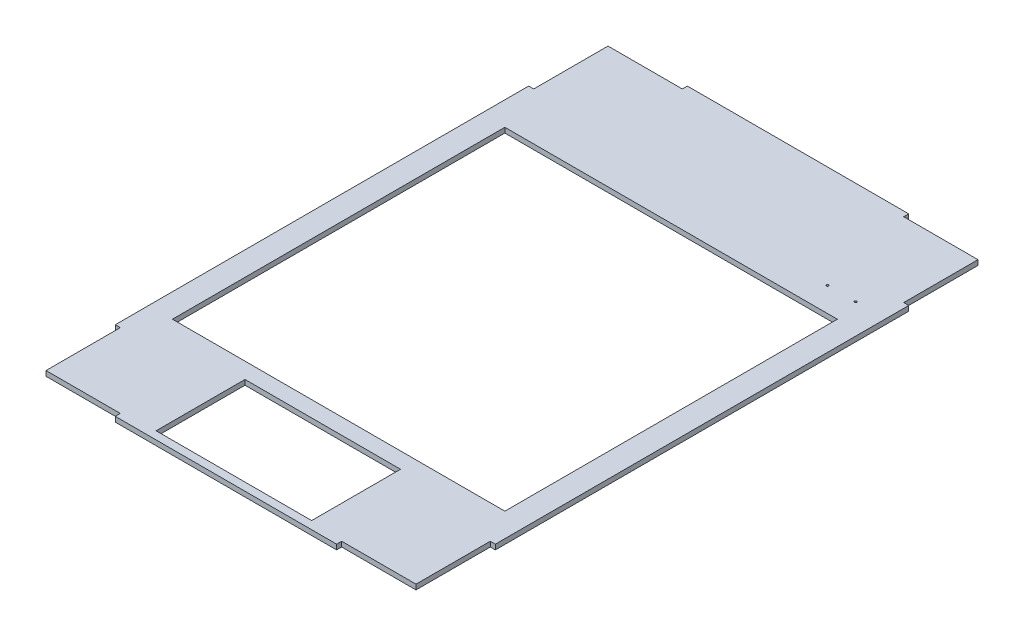
ISO-10303-21;
HEADER;
FILE_DESCRIPTION(('STEP AP214'),'2;1');
FILE_NAME('part.step','',(''),(''),'','','');
FILE_SCHEMA(('AUTOMOTIVE_DESIGN { 1 0 10303 214 1 1 1 1 }'));
ENDSEC;
DATA;
#1=APPLICATION_CONTEXT('core data for automotive mechanical design processes');
#2=APPLICATION_PROTOCOL_DEFINITION('international standard','automotive_design',2000,#1);
#3=PRODUCT_CONTEXT('',#1,'mechanical');
#4=PRODUCT('Part','Part','',(#3));
#5=PRODUCT_RELATED_PRODUCT_CATEGORY('part','',(#4));
#6=PRODUCT_DEFINITION_FORMATION('','',#4);
#7=PRODUCT_DEFINITION_CONTEXT('part definition',#1,'design');
#8=PRODUCT_DEFINITION('design','',#6,#7);
#9=PRODUCT_DEFINITION_SHAPE('','',#8);
#10=(LENGTH_UNIT() NAMED_UNIT(*) SI_UNIT(.MILLI.,.METRE.));
#11=(NAMED_UNIT(*) PLANE_ANGLE_UNIT() SI_UNIT($,.RADIAN.));
#12=(NAMED_UNIT(*) SI_UNIT($,.STERADIAN.) SOLID_ANGLE_UNIT());
#13=UNCERTAINTY_MEASURE_WITH_UNIT(LENGTH_MEASURE(1.E-05),#10,'distance_accuracy_value','');
#14=(GEOMETRIC_REPRESENTATION_CONTEXT(3) GLOBAL_UNCERTAINTY_ASSIGNED_CONTEXT((#13)) GLOBAL_UNIT_ASSIGNED_CONTEXT((#10,
#11,#12)) REPRESENTATION_CONTEXT('',''));
#15=CARTESIAN_POINT('',(0.,0.,0.));
#16=DIRECTION('',(0.,0.,1.));
#17=DIRECTION('',(1.,0.,0.));
#18=AXIS2_PLACEMENT_3D('',#15,#16,#17);
#19=CARTESIAN_POINT('',(0.,3.175,0.));
#20=DIRECTION('',(0.,-1.,0.));
#21=DIRECTION('',(0.,0.,-1.));
#22=AXIS2_PLACEMENT_3D('',#19,#20,#21);
#23=PLANE('',#22);
#24=CARTESIAN_POINT('',(166.32,3.175,-240.12));
#25=DIRECTION('',(0.,1.,0.));
#26=DIRECTION('',(0.,0.,1.));
#27=AXIS2_PLACEMENT_3D('',#24,#25,#26);
#28=CIRCLE('',#27,1.37499999999999);
#29=CARTESIAN_POINT('',(166.32,3.175,-238.745));
#30=VERTEX_POINT('',#29);
#31=EDGE_CURVE('E903',#30,#30,#28,.T.);
#32=ORIENTED_EDGE('',*,*,#31,.F.);
#33=EDGE_LOOP('',(#32));
#34=FACE_BOUND('',#33,.T.);
#35=CARTESIAN_POINT('',(201.88,3.175,-240.12));
#36=DIRECTION('',(0.,1.,0.));
#37=DIRECTION('',(0.,0.,1.));
#38=AXIS2_PLACEMENT_3D('',#35,#36,#37);
#39=CIRCLE('',#38,1.37499999999999);
#40=CARTESIAN_POINT('',(201.88,3.175,-238.745));
#41=VERTEX_POINT('',#40);
#42=EDGE_CURVE('E259',#41,#41,#39,.T.);
#43=ORIENTED_EDGE('',*,*,#42,.F.);
#44=EDGE_LOOP('',(#43));
#45=FACE_BOUND('',#44,.T.);
#46=DIRECTION('',(0.,0.,-1.));
#47=VECTOR('',#46,1.);
#48=CARTESIAN_POINT('',(209.5,3.175,209.5));
#49=LINE('',#48,#47);
#50=CARTESIAN_POINT('',(209.5,3.175,209.5));
#51=VERTEX_POINT('',#50);
#52=CARTESIAN_POINT('',(209.5,3.175,-209.5));
#53=VERTEX_POINT('',#52);
#54=EDGE_CURVE('E469',#51,#53,#49,.T.);
#55=ORIENTED_EDGE('',*,*,#54,.F.);
#56=DIRECTION('',(1.,0.,0.));
#57=VECTOR('',#56,1.);
#58=CARTESIAN_POINT('',(-209.5,3.175,209.5));
#59=LINE('',#58,#57);
#60=CARTESIAN_POINT('',(-209.5,3.175,209.5));
#61=VERTEX_POINT('',#60);
#62=EDGE_CURVE('E480',#61,#51,#59,.T.);
#63=ORIENTED_EDGE('',*,*,#62,.F.);
#64=DIRECTION('',(0.,0.,1.));
#65=VECTOR('',#64,1.);
#66=CARTESIAN_POINT('',(-209.5,3.175,209.5));
#67=LINE('',#66,#65);
#68=CARTESIAN_POINT('',(-209.5,3.175,-209.5));
#69=VERTEX_POINT('',#68);
#70=EDGE_CURVE('E476',#69,#61,#67,.T.);
#71=ORIENTED_EDGE('',*,*,#70,.F.);
#72=DIRECTION('',(-1.,0.,0.));
#73=VECTOR('',#72,1.);
#74=CARTESIAN_POINT('',(-209.5,3.175,-209.5));
#75=LINE('',#74,#73);
#76=EDGE_CURVE('E472',#53,#69,#75,.T.);
#77=ORIENTED_EDGE('',*,*,#76,.F.);
#78=EDGE_LOOP('',(#55,#63,#71,#77));
#79=FACE_BOUND('',#78,.T.);
#80=DIRECTION('',(0.,0.,1.));
#81=VECTOR('',#80,1.);
#82=CARTESIAN_POINT('',(-239.5,3.175,351.5));
#83=LINE('',#82,#81);
#84=CARTESIAN_POINT('',(-239.5,3.175,-269.5));
#85=VERTEX_POINT('',#84);
#86=CARTESIAN_POINT('',(-239.5,3.175,251.5));
#87=VERTEX_POINT('',#86);
#88=EDGE_CURVE('E48',#85,#87,#83,.T.);
#89=ORIENTED_EDGE('',*,*,#88,.T.);
#90=DIRECTION('',(-1.,0.,0.));
#91=VECTOR('',#90,1.);
#92=CARTESIAN_POINT('',(-233.15,3.175,251.5));
#93=LINE('',#92,#91);
#94=CARTESIAN_POINT('',(-233.15,3.175,251.5));
#95=VERTEX_POINT('',#94);
#96=EDGE_CURVE('E341',#95,#87,#93,.T.);
#97=ORIENTED_EDGE('',*,*,#96,.F.);
#98=DIRECTION('',(0.,0.,-1.));
#99=VECTOR('',#98,1.);
#100=CARTESIAN_POINT('',(-233.15,3.175,345.15));
#101=LINE('',#100,#99);
#102=CARTESIAN_POINT('',(-233.15,3.175,345.15));
#103=VERTEX_POINT('',#102);
#104=EDGE_CURVE('E362',#103,#95,#101,.T.);
#105=ORIENTED_EDGE('',*,*,#104,.F.);
#106=DIRECTION('',(-1.,0.,0.));
#107=VECTOR('',#106,1.);
#108=CARTESIAN_POINT('',(-139.5,3.175,345.15));
#109=LINE('',#108,#107);
#110=CARTESIAN_POINT('',(-139.5,3.175,345.15));
#111=VERTEX_POINT('',#110);
#112=EDGE_CURVE('E357',#111,#103,#109,.T.);
#113=ORIENTED_EDGE('',*,*,#112,.F.);
#114=DIRECTION('',(0.,0.,-1.));
#115=VECTOR('',#114,1.);
#116=CARTESIAN_POINT('',(-139.5,3.175,351.5));
#117=LINE('',#116,#115);
#118=CARTESIAN_POINT('',(-139.5,3.175,351.5));
#119=VERTEX_POINT('',#118);
#120=EDGE_CURVE('E353',#119,#111,#117,.T.);
#121=ORIENTED_EDGE('',*,*,#120,.F.);
#122=DIRECTION('',(1.,0.,0.));
#123=VECTOR('',#122,1.);
#124=CARTESIAN_POINT('',(-239.5,3.175,351.5));
#125=LINE('',#124,#123);
#126=CARTESIAN_POINT('',(139.5,3.175,351.5));
#127=VERTEX_POINT('',#126);
#128=EDGE_CURVE('E11',#119,#127,#125,.T.);
#129=ORIENTED_EDGE('',*,*,#128,.T.);
#130=DIRECTION('',(0.,0.,1.));
#131=VECTOR('',#130,1.);
#132=CARTESIAN_POINT('',(139.5,3.175,345.15));
#133=LINE('',#132,#131);
#134=CARTESIAN_POINT('',(139.5,3.175,345.15));
#135=VERTEX_POINT('',#134);
#136=EDGE_CURVE('E294',#135,#127,#133,.T.);
#137=ORIENTED_EDGE('',*,*,#136,.F.);
#138=DIRECTION('',(-1.,0.,0.));
#139=VECTOR('',#138,1.);
#140=CARTESIAN_POINT('',(233.15,3.175,345.15));
#141=LINE('',#140,#139);
#142=CARTESIAN_POINT('',(233.15,3.175,345.15));
#143=VERTEX_POINT('',#142);
#144=EDGE_CURVE('E316',#143,#135,#141,.T.);
#145=ORIENTED_EDGE('',*,*,#144,.F.);
#146=DIRECTION('',(0.,0.,1.));
#147=VECTOR('',#146,1.);
#148=CARTESIAN_POINT('',(233.15,3.175,251.5));
#149=LINE('',#148,#147);
#150=CARTESIAN_POINT('',(233.15,3.175,251.5));
#151=VERTEX_POINT('',#150);
#152=EDGE_CURVE('E311',#151,#143,#149,.T.);
#153=ORIENTED_EDGE('',*,*,#152,.F.);
#154=DIRECTION('',(-1.,0.,0.));
#155=VECTOR('',#154,1.);
#156=CARTESIAN_POINT('',(239.5,3.175,251.5));
#157=LINE('',#156,#155);
#158=CARTESIAN_POINT('',(239.5,3.175,251.5));
#159=VERTEX_POINT('',#158);
#160=EDGE_CURVE('E307',#159,#151,#157,.T.);
#161=ORIENTED_EDGE('',*,*,#160,.F.);
#162=DIRECTION('',(0.,0.,-1.));
#163=VECTOR('',#162,1.);
#164=CARTESIAN_POINT('',(239.5,3.175,351.5));
#165=LINE('',#164,#163);
#166=CARTESIAN_POINT('',(239.5,3.175,-269.5));
#167=VERTEX_POINT('',#166);
#168=EDGE_CURVE('E512',#159,#167,#165,.T.);
#169=ORIENTED_EDGE('',*,*,#168,.T.);
#170=DIRECTION('',(1.,0.,0.));
#171=VECTOR('',#170,1.);
#172=CARTESIAN_POINT('',(233.15,3.175,-269.5));
#173=LINE('',#172,#171);
#174=CARTESIAN_POINT('',(233.15,3.175,-269.5));
#175=VERTEX_POINT('',#174);
#176=EDGE_CURVE('E253',#175,#167,#173,.T.);
#177=ORIENTED_EDGE('',*,*,#176,.F.);
#178=DIRECTION('',(0.,0.,1.));
#179=VECTOR('',#178,1.);
#180=CARTESIAN_POINT('',(233.15,3.175,-363.15));
#181=LINE('',#180,#179);
#182=CARTESIAN_POINT('',(233.15,3.175,-363.15));
#183=VERTEX_POINT('',#182);
#184=EDGE_CURVE('E256',#183,#175,#181,.T.);
#185=ORIENTED_EDGE('',*,*,#184,.F.);
#186=DIRECTION('',(1.,0.,0.));
#187=VECTOR('',#186,1.);
#188=CARTESIAN_POINT('',(139.5,3.175,-363.15));
#189=LINE('',#188,#187);
#190=CARTESIAN_POINT('',(139.5,3.175,-363.15));
#191=VERTEX_POINT('',#190);
#192=EDGE_CURVE('E270',#191,#183,#189,.T.);
#193=ORIENTED_EDGE('',*,*,#192,.F.);
#194=DIRECTION('',(0.,0.,1.));
#195=VECTOR('',#194,1.);
#196=CARTESIAN_POINT('',(139.5,3.175,-369.5));
#197=LINE('',#196,#195);
#198=CARTESIAN_POINT('',(139.5,3.175,-369.5));
#199=VERTEX_POINT('',#198);
#200=EDGE_CURVE('E228',#199,#191,#197,.T.);
#201=ORIENTED_EDGE('',*,*,#200,.F.);
#202=DIRECTION('',(-1.,0.,0.));
#203=VECTOR('',#202,1.);
#204=CARTESIAN_POINT('',(-239.5,3.175,-369.5));
#205=LINE('',#204,#203);
#206=CARTESIAN_POINT('',(-139.5,3.175,-369.5));
#207=VERTEX_POINT('',#206);
#208=EDGE_CURVE('E516',#199,#207,#205,.T.);
#209=ORIENTED_EDGE('',*,*,#208,.T.);
#210=DIRECTION('',(0.,0.,-1.));
#211=VECTOR('',#210,1.);
#212=CARTESIAN_POINT('',(-139.5,3.175,-363.15));
#213=LINE('',#212,#211);
#214=CARTESIAN_POINT('',(-139.5,3.175,-363.15));
#215=VERTEX_POINT('',#214);
#216=EDGE_CURVE('E385',#215,#207,#213,.T.);
#217=ORIENTED_EDGE('',*,*,#216,.F.);
#218=DIRECTION('',(1.,0.,0.));
#219=VECTOR('',#218,1.);
#220=CARTESIAN_POINT('',(-233.15,3.175,-363.15));
#221=LINE('',#220,#219);
#222=CARTESIAN_POINT('',(-233.15,3.175,-363.15));
#223=VERTEX_POINT('',#222);
#224=EDGE_CURVE('E404',#223,#215,#221,.T.);
#225=ORIENTED_EDGE('',*,*,#224,.F.);
#226=DIRECTION('',(0.,0.,-1.));
#227=VECTOR('',#226,1.);
#228=CARTESIAN_POINT('',(-233.15,3.175,-269.5));
#229=LINE('',#228,#227);
#230=CARTESIAN_POINT('',(-233.15,3.175,-269.5));
#231=VERTEX_POINT('',#230);
#232=EDGE_CURVE('E400',#231,#223,#229,.T.);
#233=ORIENTED_EDGE('',*,*,#232,.F.);
#234=DIRECTION('',(1.,0.,0.));
#235=VECTOR('',#234,1.);
#236=CARTESIAN_POINT('',(-239.5,3.175,-269.5));
#237=LINE('',#236,#235);
#238=EDGE_CURVE('E281',#85,#231,#237,.T.);
#239=ORIENTED_EDGE('',*,*,#238,.F.);
#240=EDGE_LOOP('',(#89,#97,#105,#113,#121,#129,#137,#145,#153,#161,#169,#177,#185,#193,#201,
#209,#217,#225,#233,#239));
#241=FACE_BOUND('',#240,.T.);
#242=DIRECTION('',(0.,0.,-1.));
#243=VECTOR('',#242,1.);
#244=CARTESIAN_POINT('',(98.0000000000001,3.175,341.5));
#245=LINE('',#244,#243);
#246=CARTESIAN_POINT('',(98.0000000000001,3.175,341.5));
#247=VERTEX_POINT('',#246);
#248=CARTESIAN_POINT('',(98.0000000000001,3.175,229.5));
#249=VERTEX_POINT('',#248);
#250=EDGE_CURVE('E426',#247,#249,#245,.T.);
#251=ORIENTED_EDGE('',*,*,#250,.F.);
#252=DIRECTION('',(1.,0.,0.));
#253=VECTOR('',#252,1.);
#254=CARTESIAN_POINT('',(-97.9999999999999,3.175,341.5));
#255=LINE('',#254,#253);
#256=CARTESIAN_POINT('',(-97.9999999999999,3.175,341.5));
#257=VERTEX_POINT('',#256);
#258=EDGE_CURVE('E437',#257,#247,#255,.T.);
#259=ORIENTED_EDGE('',*,*,#258,.F.);
#260=DIRECTION('',(0.,0.,1.));
#261=VECTOR('',#260,1.);
#262=CARTESIAN_POINT('',(-97.9999999999999,3.175,341.5));
#263=LINE('',#262,#261);
#264=CARTESIAN_POINT('',(-97.9999999999999,3.175,229.5));
#265=VERTEX_POINT('',#264);
#266=EDGE_CURVE('E433',#265,#257,#263,.T.);
#267=ORIENTED_EDGE('',*,*,#266,.F.);
#268=DIRECTION('',(-1.,0.,0.));
#269=VECTOR('',#268,1.);
#270=CARTESIAN_POINT('',(-97.9999999999999,3.175,229.5));
#271=LINE('',#270,#269);
#272=EDGE_CURVE('E429',#249,#265,#271,.T.);
#273=ORIENTED_EDGE('',*,*,#272,.F.);
#274=EDGE_LOOP('',(#251,#259,#267,#273));
#275=FACE_BOUND('',#274,.T.);
#276=ADVANCED_FACE('F38',(#34,#45,#79,#241,#275),#23,.F.);
#277=CARTESIAN_POINT('',(0.,-3.175,0.));
#278=DIRECTION('',(0.,-1.,0.));
#279=DIRECTION('',(0.,0.,-1.));
#280=AXIS2_PLACEMENT_3D('',#277,#278,#279);
#281=PLANE('',#280);
#282=CARTESIAN_POINT('',(166.32,-3.175,-240.12));
#283=DIRECTION('',(0.,1.,0.));
#284=DIRECTION('',(0.,0.,1.));
#285=AXIS2_PLACEMENT_3D('',#282,#283,#284);
#286=CIRCLE('',#285,1.37499999999999);
#287=CARTESIAN_POINT('',(166.32,-3.175,-238.745));
#288=VERTEX_POINT('',#287);
#289=EDGE_CURVE('E358',#288,#288,#286,.T.);
#290=ORIENTED_EDGE('',*,*,#289,.T.);
#291=EDGE_LOOP('',(#290));
#292=FACE_BOUND('',#291,.T.);
#293=CARTESIAN_POINT('',(201.88,-3.175,-240.12));
#294=DIRECTION('',(0.,1.,0.));
#295=DIRECTION('',(0.,0.,1.));
#296=AXIS2_PLACEMENT_3D('',#293,#294,#295);
#297=CIRCLE('',#296,1.37499999999999);
#298=CARTESIAN_POINT('',(201.88,-3.175,-238.745));
#299=VERTEX_POINT('',#298);
#300=EDGE_CURVE('E905',#299,#299,#297,.T.);
#301=ORIENTED_EDGE('',*,*,#300,.T.);
#302=EDGE_LOOP('',(#301));
#303=FACE_BOUND('',#302,.T.);
#304=DIRECTION('',(-1.,0.,0.));
#305=VECTOR('',#304,1.);
#306=CARTESIAN_POINT('',(-233.15,-3.175,251.5));
#307=LINE('',#306,#305);
#308=CARTESIAN_POINT('',(-233.15,-3.175,251.5));
#309=VERTEX_POINT('',#308);
#310=CARTESIAN_POINT('',(-239.5,-3.175,251.5));
#311=VERTEX_POINT('',#310);
#312=EDGE_CURVE('E349',#309,#311,#307,.T.);
#313=ORIENTED_EDGE('',*,*,#312,.T.);
#314=DIRECTION('',(0.,0.,1.));
#315=VECTOR('',#314,1.);
#316=CARTESIAN_POINT('',(-239.5,-3.175,351.5));
#317=LINE('',#316,#315);
#318=CARTESIAN_POINT('',(-239.5,-3.175,-269.5));
#319=VERTEX_POINT('',#318);
#320=EDGE_CURVE('E527',#319,#311,#317,.T.);
#321=ORIENTED_EDGE('',*,*,#320,.F.);
#322=DIRECTION('',(1.,0.,0.));
#323=VECTOR('',#322,1.);
#324=CARTESIAN_POINT('',(-239.5,-3.175,-269.5));
#325=LINE('',#324,#323);
#326=CARTESIAN_POINT('',(-233.15,-3.175,-269.5));
#327=VERTEX_POINT('',#326);
#328=EDGE_CURVE('E64',#319,#327,#325,.T.);
#329=ORIENTED_EDGE('',*,*,#328,.T.);
#330=DIRECTION('',(0.,0.,-1.));
#331=VECTOR('',#330,1.);
#332=CARTESIAN_POINT('',(-233.15,-3.175,-269.5));
#333=LINE('',#332,#331);
#334=CARTESIAN_POINT('',(-233.15,-3.175,-363.15));
#335=VERTEX_POINT('',#334);
#336=EDGE_CURVE('E384',#327,#335,#333,.T.);
#337=ORIENTED_EDGE('',*,*,#336,.T.);
#338=DIRECTION('',(1.,0.,0.));
#339=VECTOR('',#338,1.);
#340=CARTESIAN_POINT('',(-233.15,-3.175,-363.15));
#341=LINE('',#340,#339);
#342=CARTESIAN_POINT('',(-139.5,-3.175,-363.15));
#343=VERTEX_POINT('',#342);
#344=EDGE_CURVE('E389',#335,#343,#341,.T.);
#345=ORIENTED_EDGE('',*,*,#344,.T.);
#346=DIRECTION('',(0.,0.,-1.));
#347=VECTOR('',#346,1.);
#348=CARTESIAN_POINT('',(-139.5,-3.175,-363.15));
#349=LINE('',#348,#347);
#350=CARTESIAN_POINT('',(-139.5,-3.175,-369.5));
#351=VERTEX_POINT('',#350);
#352=EDGE_CURVE('E393',#343,#351,#349,.T.);
#353=ORIENTED_EDGE('',*,*,#352,.T.);
#354=DIRECTION('',(-1.,0.,0.));
#355=VECTOR('',#354,1.);
#356=CARTESIAN_POINT('',(-239.5,-3.175,-369.5));
#357=LINE('',#356,#355);
#358=CARTESIAN_POINT('',(139.5,-3.175,-369.5));
#359=VERTEX_POINT('',#358);
#360=EDGE_CURVE('E251',#359,#351,#357,.T.);
#361=ORIENTED_EDGE('',*,*,#360,.F.);
#362=DIRECTION('',(0.,0.,1.));
#363=VECTOR('',#362,1.);
#364=CARTESIAN_POINT('',(139.5,-3.175,-369.5));
#365=LINE('',#364,#363);
#366=CARTESIAN_POINT('',(139.5,-3.175,-363.15));
#367=VERTEX_POINT('',#366);
#368=EDGE_CURVE('E56',#359,#367,#365,.T.);
#369=ORIENTED_EDGE('',*,*,#368,.T.);
#370=DIRECTION('',(1.,0.,0.));
#371=VECTOR('',#370,1.);
#372=CARTESIAN_POINT('',(139.5,-3.175,-363.15));
#373=LINE('',#372,#371);
#374=CARTESIAN_POINT('',(233.15,-3.175,-363.15));
#375=VERTEX_POINT('',#374);
#376=EDGE_CURVE('E237',#367,#375,#373,.T.);
#377=ORIENTED_EDGE('',*,*,#376,.T.);
#378=DIRECTION('',(0.,0.,1.));
#379=VECTOR('',#378,1.);
#380=CARTESIAN_POINT('',(233.15,-3.175,-363.15));
#381=LINE('',#380,#379);
#382=CARTESIAN_POINT('',(233.15,-3.175,-269.5));
#383=VERTEX_POINT('',#382);
#384=EDGE_CURVE('E243',#375,#383,#381,.T.);
#385=ORIENTED_EDGE('',*,*,#384,.T.);
#386=DIRECTION('',(1.,0.,0.));
#387=VECTOR('',#386,1.);
#388=CARTESIAN_POINT('',(233.15,-3.175,-269.5));
#389=LINE('',#388,#387);
#390=CARTESIAN_POINT('',(239.5,-3.175,-269.5));
#391=VERTEX_POINT('',#390);
#392=EDGE_CURVE('E264',#383,#391,#389,.T.);
#393=ORIENTED_EDGE('',*,*,#392,.T.);
#394=DIRECTION('',(0.,0.,-1.));
#395=VECTOR('',#394,1.);
#396=CARTESIAN_POINT('',(239.5,-3.175,351.5));
#397=LINE('',#396,#395);
#398=CARTESIAN_POINT('',(239.5,-3.175,251.5));
#399=VERTEX_POINT('',#398);
#400=EDGE_CURVE('E511',#399,#391,#397,.T.);
#401=ORIENTED_EDGE('',*,*,#400,.F.);
#402=DIRECTION('',(-1.,0.,0.));
#403=VECTOR('',#402,1.);
#404=CARTESIAN_POINT('',(239.5,-3.175,251.5));
#405=LINE('',#404,#403);
#406=CARTESIAN_POINT('',(233.15,-3.175,251.5));
#407=VERTEX_POINT('',#406);
#408=EDGE_CURVE('E289',#399,#407,#405,.T.);
#409=ORIENTED_EDGE('',*,*,#408,.T.);
#410=DIRECTION('',(0.,0.,1.));
#411=VECTOR('',#410,1.);
#412=CARTESIAN_POINT('',(233.15,-3.175,251.5));
#413=LINE('',#412,#411);
#414=CARTESIAN_POINT('',(233.15,-3.175,345.15));
#415=VERTEX_POINT('',#414);
#416=EDGE_CURVE('E293',#407,#415,#413,.T.);
#417=ORIENTED_EDGE('',*,*,#416,.T.);
#418=DIRECTION('',(-1.,0.,0.));
#419=VECTOR('',#418,1.);
#420=CARTESIAN_POINT('',(233.15,-3.175,345.15));
#421=LINE('',#420,#419);
#422=CARTESIAN_POINT('',(139.5,-3.175,345.15));
#423=VERTEX_POINT('',#422);
#424=EDGE_CURVE('E298',#415,#423,#421,.T.);
#425=ORIENTED_EDGE('',*,*,#424,.T.);
#426=DIRECTION('',(0.,0.,1.));
#427=VECTOR('',#426,1.);
#428=CARTESIAN_POINT('',(139.5,-3.175,345.15));
#429=LINE('',#428,#427);
#430=CARTESIAN_POINT('',(139.5,-3.175,351.5));
#431=VERTEX_POINT('',#430);
#432=EDGE_CURVE('E302',#423,#431,#429,.T.);
#433=ORIENTED_EDGE('',*,*,#432,.T.);
#434=DIRECTION('',(1.,0.,0.));
#435=VECTOR('',#434,1.);
#436=CARTESIAN_POINT('',(-239.5,-3.175,351.5));
#437=LINE('',#436,#435);
#438=CARTESIAN_POINT('',(-139.5,-3.175,351.5));
#439=VERTEX_POINT('',#438);
#440=EDGE_CURVE('E42',#439,#431,#437,.T.);
#441=ORIENTED_EDGE('',*,*,#440,.F.);
#442=DIRECTION('',(0.,0.,-1.));
#443=VECTOR('',#442,1.);
#444=CARTESIAN_POINT('',(-139.5,-3.175,351.5));
#445=LINE('',#444,#443);
#446=CARTESIAN_POINT('',(-139.5,-3.175,345.15));
#447=VERTEX_POINT('',#446);
#448=EDGE_CURVE('E336',#439,#447,#445,.T.);
#449=ORIENTED_EDGE('',*,*,#448,.T.);
#450=DIRECTION('',(-1.,0.,0.));
#451=VECTOR('',#450,1.);
#452=CARTESIAN_POINT('',(-139.5,-3.175,345.15));
#453=LINE('',#452,#451);
#454=CARTESIAN_POINT('',(-233.15,-3.175,345.15));
#455=VERTEX_POINT('',#454);
#456=EDGE_CURVE('E340',#447,#455,#453,.T.);
#457=ORIENTED_EDGE('',*,*,#456,.T.);
#458=DIRECTION('',(0.,0.,-1.));
#459=VECTOR('',#458,1.);
#460=CARTESIAN_POINT('',(-233.15,-3.175,345.15));
#461=LINE('',#460,#459);
#462=EDGE_CURVE('E345',#455,#309,#461,.T.);
#463=ORIENTED_EDGE('',*,*,#462,.T.);
#464=EDGE_LOOP('',(#313,#321,#329,#337,#345,#353,#361,#369,#377,#385,#393,#401,#409,#417,#425,
#433,#441,#449,#457,#463));
#465=FACE_BOUND('',#464,.T.);
#466=DIRECTION('',(1.,0.,0.));
#467=VECTOR('',#466,1.);
#468=CARTESIAN_POINT('',(-209.5,-3.175,209.5));
#469=LINE('',#468,#467);
#470=CARTESIAN_POINT('',(-209.5,-3.175,209.5));
#471=VERTEX_POINT('',#470);
#472=CARTESIAN_POINT('',(209.5,-3.175,209.5));
#473=VERTEX_POINT('',#472);
#474=EDGE_CURVE('E473',#471,#473,#469,.T.);
#475=ORIENTED_EDGE('',*,*,#474,.T.);
#476=DIRECTION('',(0.,0.,-1.));
#477=VECTOR('',#476,1.);
#478=CARTESIAN_POINT('',(209.5,-3.175,209.5));
#479=LINE('',#478,#477);
#480=CARTESIAN_POINT('',(209.5,-3.175,-209.5));
#481=VERTEX_POINT('',#480);
#482=EDGE_CURVE('E468',#473,#481,#479,.T.);
#483=ORIENTED_EDGE('',*,*,#482,.T.);
#484=DIRECTION('',(-1.,0.,0.));
#485=VECTOR('',#484,1.);
#486=CARTESIAN_POINT('',(-209.5,-3.175,-209.5));
#487=LINE('',#486,#485);
#488=CARTESIAN_POINT('',(-209.5,-3.175,-209.5));
#489=VERTEX_POINT('',#488);
#490=EDGE_CURVE('E487',#481,#489,#487,.T.);
#491=ORIENTED_EDGE('',*,*,#490,.T.);
#492=DIRECTION('',(0.,0.,1.));
#493=VECTOR('',#492,1.);
#494=CARTESIAN_POINT('',(-209.5,-3.175,209.5));
#495=LINE('',#494,#493);
#496=EDGE_CURVE('E491',#489,#471,#495,.T.);
#497=ORIENTED_EDGE('',*,*,#496,.T.);
#498=EDGE_LOOP('',(#475,#483,#491,#497));
#499=FACE_BOUND('',#498,.T.);
#500=DIRECTION('',(1.,0.,0.));
#501=VECTOR('',#500,1.);
#502=CARTESIAN_POINT('',(-97.9999999999999,-3.175,341.5));
#503=LINE('',#502,#501);
#504=CARTESIAN_POINT('',(-97.9999999999999,-3.175,341.5));
#505=VERTEX_POINT('',#504);
#506=CARTESIAN_POINT('',(98.0000000000001,-3.175,341.5));
#507=VERTEX_POINT('',#506);
#508=EDGE_CURVE('E430',#505,#507,#503,.T.);
#509=ORIENTED_EDGE('',*,*,#508,.T.);
#510=DIRECTION('',(0.,0.,-1.));
#511=VECTOR('',#510,1.);
#512=CARTESIAN_POINT('',(98.0000000000001,-3.175,341.5));
#513=LINE('',#512,#511);
#514=CARTESIAN_POINT('',(98.0000000000001,-3.175,229.5));
#515=VERTEX_POINT('',#514);
#516=EDGE_CURVE('E414',#507,#515,#513,.T.);
#517=ORIENTED_EDGE('',*,*,#516,.T.);
#518=DIRECTION('',(-1.,0.,0.));
#519=VECTOR('',#518,1.);
#520=CARTESIAN_POINT('',(-97.9999999999999,-3.175,229.5));
#521=LINE('',#520,#519);
#522=CARTESIAN_POINT('',(-97.9999999999999,-3.175,229.5));
#523=VERTEX_POINT('',#522);
#524=EDGE_CURVE('E444',#515,#523,#521,.T.);
#525=ORIENTED_EDGE('',*,*,#524,.T.);
#526=DIRECTION('',(0.,0.,1.));
#527=VECTOR('',#526,1.);
#528=CARTESIAN_POINT('',(-97.9999999999999,-3.175,341.5));
#529=LINE('',#528,#527);
#530=EDGE_CURVE('E448',#523,#505,#529,.T.);
#531=ORIENTED_EDGE('',*,*,#530,.T.);
#532=EDGE_LOOP('',(#509,#517,#525,#531));
#533=FACE_BOUND('',#532,.T.);
#534=ADVANCED_FACE('F247',(#292,#303,#465,#499,#533),#281,.T.);
#535=CARTESIAN_POINT('',(239.5,3.175,351.5));
#536=DIRECTION('',(-1.,0.,0.));
#537=DIRECTION('',(0.,0.,1.));
#538=AXIS2_PLACEMENT_3D('',#535,#536,#537);
#539=PLANE('',#538);
#540=ORIENTED_EDGE('',*,*,#168,.F.);
#541=DIRECTION('',(0.,1.,0.));
#542=VECTOR('',#541,1.);
#543=CARTESIAN_POINT('',(239.5,-3.175,251.5));
#544=LINE('',#543,#542);
#545=EDGE_CURVE('E306',#399,#159,#544,.T.);
#546=ORIENTED_EDGE('',*,*,#545,.F.);
#547=ORIENTED_EDGE('',*,*,#400,.T.);
#548=DIRECTION('',(0.,1.,0.));
#549=VECTOR('',#548,1.);
#550=CARTESIAN_POINT('',(239.5,-3.175,-269.5));
#551=LINE('',#550,#549);
#552=EDGE_CURVE('E277',#391,#167,#551,.T.);
#553=ORIENTED_EDGE('',*,*,#552,.T.);
#554=EDGE_LOOP('',(#540,#546,#547,#553));
#555=FACE_BOUND('',#554,.T.);
#556=ADVANCED_FACE('F40',(#555),#539,.F.);
#557=CARTESIAN_POINT('',(-239.5,3.175,-369.5));
#558=DIRECTION('',(0.,0.,1.));
#559=DIRECTION('',(1.,0.,0.));
#560=AXIS2_PLACEMENT_3D('',#557,#558,#559);
#561=PLANE('',#560);
#562=ORIENTED_EDGE('',*,*,#208,.F.);
#563=DIRECTION('',(0.,1.,0.));
#564=VECTOR('',#563,1.);
#565=CARTESIAN_POINT('',(139.5,-3.175,-369.5));
#566=LINE('',#565,#564);
#567=EDGE_CURVE('E234',#359,#199,#566,.T.);
#568=ORIENTED_EDGE('',*,*,#567,.F.);
#569=ORIENTED_EDGE('',*,*,#360,.T.);
#570=DIRECTION('',(0.,1.,0.));
#571=VECTOR('',#570,1.);
#572=CARTESIAN_POINT('',(-139.5,-3.175,-369.5));
#573=LINE('',#572,#571);
#574=EDGE_CURVE('E410',#351,#207,#573,.T.);
#575=ORIENTED_EDGE('',*,*,#574,.T.);
#576=EDGE_LOOP('',(#562,#568,#569,#575));
#577=FACE_BOUND('',#576,.T.);
#578=ADVANCED_FACE('F581',(#577),#561,.F.);
#579=CARTESIAN_POINT('',(-239.5,3.175,351.5));
#580=DIRECTION('',(1.,0.,0.));
#581=DIRECTION('',(0.,0.,-1.));
#582=AXIS2_PLACEMENT_3D('',#579,#580,#581);
#583=PLANE('',#582);
#584=ORIENTED_EDGE('',*,*,#320,.T.);
#585=DIRECTION('',(0.,1.,0.));
#586=VECTOR('',#585,1.);
#587=CARTESIAN_POINT('',(-239.5,-3.175,251.5));
#588=LINE('',#587,#586);
#589=EDGE_CURVE('E312',#311,#87,#588,.T.);
#590=ORIENTED_EDGE('',*,*,#589,.T.);
#591=ORIENTED_EDGE('',*,*,#88,.F.);
#592=DIRECTION('',(0.,1.,0.));
#593=VECTOR('',#592,1.);
#594=CARTESIAN_POINT('',(-239.5,-3.175,-269.5));
#595=LINE('',#594,#593);
#596=EDGE_CURVE('E396',#319,#85,#595,.T.);
#597=ORIENTED_EDGE('',*,*,#596,.F.);
#598=EDGE_LOOP('',(#584,#590,#591,#597));
#599=FACE_BOUND('',#598,.T.);
#600=ADVANCED_FACE('F564',(#599),#583,.F.);
#601=CARTESIAN_POINT('',(-239.5,3.175,351.5));
#602=DIRECTION('',(0.,0.,-1.));
#603=DIRECTION('',(-1.,0.,0.));
#604=AXIS2_PLACEMENT_3D('',#601,#602,#603);
#605=PLANE('',#604);
#606=ORIENTED_EDGE('',*,*,#128,.F.);
#607=DIRECTION('',(0.,1.,0.));
#608=VECTOR('',#607,1.);
#609=CARTESIAN_POINT('',(-139.5,-3.175,351.5));
#610=LINE('',#609,#608);
#611=EDGE_CURVE('E352',#439,#119,#610,.T.);
#612=ORIENTED_EDGE('',*,*,#611,.F.);
#613=ORIENTED_EDGE('',*,*,#440,.T.);
#614=DIRECTION('',(0.,1.,0.));
#615=VECTOR('',#614,1.);
#616=CARTESIAN_POINT('',(139.5,-3.175,351.5));
#617=LINE('',#616,#615);
#618=EDGE_CURVE('E271',#431,#127,#617,.T.);
#619=ORIENTED_EDGE('',*,*,#618,.T.);
#620=EDGE_LOOP('',(#606,#612,#613,#619));
#621=FACE_BOUND('',#620,.T.);
#622=ADVANCED_FACE('F538',(#621),#605,.F.);
#623=CARTESIAN_POINT('',(209.5,3.175,209.5));
#624=DIRECTION('',(-1.,0.,0.));
#625=DIRECTION('',(0.,0.,1.));
#626=AXIS2_PLACEMENT_3D('',#623,#624,#625);
#627=PLANE('',#626);
#628=ORIENTED_EDGE('',*,*,#482,.F.);
#629=DIRECTION('',(0.,-1.,0.));
#630=VECTOR('',#629,1.);
#631=CARTESIAN_POINT('',(209.5,3.175,209.5));
#632=LINE('',#631,#630);
#633=EDGE_CURVE('E483',#51,#473,#632,.T.);
#634=ORIENTED_EDGE('',*,*,#633,.F.);
#635=ORIENTED_EDGE('',*,*,#54,.T.);
#636=DIRECTION('',(0.,-1.,0.));
#637=VECTOR('',#636,1.);
#638=CARTESIAN_POINT('',(209.5,3.175,-209.5));
#639=LINE('',#638,#637);
#640=EDGE_CURVE('E507',#53,#481,#639,.T.);
#641=ORIENTED_EDGE('',*,*,#640,.T.);
#642=EDGE_LOOP('',(#628,#634,#635,#641));
#643=FACE_BOUND('',#642,.T.);
#644=ADVANCED_FACE('F621',(#643),#627,.T.);
#645=CARTESIAN_POINT('',(-209.5,3.175,-209.5));
#646=DIRECTION('',(0.,0.,1.));
#647=DIRECTION('',(1.,0.,0.));
#648=AXIS2_PLACEMENT_3D('',#645,#646,#647);
#649=PLANE('',#648);
#650=ORIENTED_EDGE('',*,*,#490,.F.);
#651=ORIENTED_EDGE('',*,*,#640,.F.);
#652=ORIENTED_EDGE('',*,*,#76,.T.);
#653=DIRECTION('',(0.,-1.,0.));
#654=VECTOR('',#653,1.);
#655=CARTESIAN_POINT('',(-209.5,3.175,-209.5));
#656=LINE('',#655,#654);
#657=EDGE_CURVE('E504',#69,#489,#656,.T.);
#658=ORIENTED_EDGE('',*,*,#657,.T.);
#659=EDGE_LOOP('',(#650,#651,#652,#658));
#660=FACE_BOUND('',#659,.T.);
#661=ADVANCED_FACE('F787',(#660),#649,.T.);
#662=CARTESIAN_POINT('',(-209.5,3.175,209.5));
#663=DIRECTION('',(1.,0.,0.));
#664=DIRECTION('',(0.,0.,-1.));
#665=AXIS2_PLACEMENT_3D('',#662,#663,#664);
#666=PLANE('',#665);
#667=ORIENTED_EDGE('',*,*,#496,.F.);
#668=ORIENTED_EDGE('',*,*,#657,.F.);
#669=ORIENTED_EDGE('',*,*,#70,.T.);
#670=DIRECTION('',(0.,-1.,0.));
#671=VECTOR('',#670,1.);
#672=CARTESIAN_POINT('',(-209.5,3.175,209.5));
#673=LINE('',#672,#671);
#674=EDGE_CURVE('E501',#61,#471,#673,.T.);
#675=ORIENTED_EDGE('',*,*,#674,.T.);
#676=EDGE_LOOP('',(#667,#668,#669,#675));
#677=FACE_BOUND('',#676,.T.);
#678=ADVANCED_FACE('F793',(#677),#666,.T.);
#679=CARTESIAN_POINT('',(-209.5,3.175,209.5));
#680=DIRECTION('',(0.,0.,-1.));
#681=DIRECTION('',(-1.,0.,0.));
#682=AXIS2_PLACEMENT_3D('',#679,#680,#681);
#683=PLANE('',#682);
#684=ORIENTED_EDGE('',*,*,#474,.F.);
#685=ORIENTED_EDGE('',*,*,#674,.F.);
#686=ORIENTED_EDGE('',*,*,#62,.T.);
#687=ORIENTED_EDGE('',*,*,#633,.T.);
#688=EDGE_LOOP('',(#684,#685,#686,#687));
#689=FACE_BOUND('',#688,.T.);
#690=ADVANCED_FACE('F800',(#689),#683,.T.);
#691=CARTESIAN_POINT('',(98.0000000000001,3.175,341.5));
#692=DIRECTION('',(-1.,0.,0.));
#693=DIRECTION('',(0.,0.,1.));
#694=AXIS2_PLACEMENT_3D('',#691,#692,#693);
#695=PLANE('',#694);
#696=ORIENTED_EDGE('',*,*,#516,.F.);
#697=DIRECTION('',(0.,-1.,0.));
#698=VECTOR('',#697,1.);
#699=CARTESIAN_POINT('',(98.0000000000001,3.175,341.5));
#700=LINE('',#699,#698);
#701=EDGE_CURVE('E440',#247,#507,#700,.T.);
#702=ORIENTED_EDGE('',*,*,#701,.F.);
#703=ORIENTED_EDGE('',*,*,#250,.T.);
#704=DIRECTION('',(0.,-1.,0.));
#705=VECTOR('',#704,1.);
#706=CARTESIAN_POINT('',(98.0000000000001,3.175,229.5));
#707=LINE('',#706,#705);
#708=EDGE_CURVE('E464',#249,#515,#707,.T.);
#709=ORIENTED_EDGE('',*,*,#708,.T.);
#710=EDGE_LOOP('',(#696,#702,#703,#709));
#711=FACE_BOUND('',#710,.T.);
#712=ADVANCED_FACE('F808',(#711),#695,.T.);
#713=CARTESIAN_POINT('',(-97.9999999999999,3.175,229.5));
#714=DIRECTION('',(0.,0.,1.));
#715=DIRECTION('',(1.,0.,0.));
#716=AXIS2_PLACEMENT_3D('',#713,#714,#715);
#717=PLANE('',#716);
#718=ORIENTED_EDGE('',*,*,#524,.F.);
#719=ORIENTED_EDGE('',*,*,#708,.F.);
#720=ORIENTED_EDGE('',*,*,#272,.T.);
#721=DIRECTION('',(0.,-1.,0.));
#722=VECTOR('',#721,1.);
#723=CARTESIAN_POINT('',(-97.9999999999999,3.175,229.5));
#724=LINE('',#723,#722);
#725=EDGE_CURVE('E461',#265,#523,#724,.T.);
#726=ORIENTED_EDGE('',*,*,#725,.T.);
#727=EDGE_LOOP('',(#718,#719,#720,#726));
#728=FACE_BOUND('',#727,.T.);
#729=ADVANCED_FACE('F816',(#728),#717,.T.);
#730=CARTESIAN_POINT('',(-97.9999999999999,3.175,341.5));
#731=DIRECTION('',(1.,0.,0.));
#732=DIRECTION('',(0.,0.,-1.));
#733=AXIS2_PLACEMENT_3D('',#730,#731,#732);
#734=PLANE('',#733);
#735=ORIENTED_EDGE('',*,*,#530,.F.);
#736=ORIENTED_EDGE('',*,*,#725,.F.);
#737=ORIENTED_EDGE('',*,*,#266,.T.);
#738=DIRECTION('',(0.,-1.,0.));
#739=VECTOR('',#738,1.);
#740=CARTESIAN_POINT('',(-97.9999999999999,3.175,341.5));
#741=LINE('',#740,#739);
#742=EDGE_CURVE('E458',#257,#505,#741,.T.);
#743=ORIENTED_EDGE('',*,*,#742,.T.);
#744=EDGE_LOOP('',(#735,#736,#737,#743));
#745=FACE_BOUND('',#744,.T.);
#746=ADVANCED_FACE('F824',(#745),#734,.T.);
#747=CARTESIAN_POINT('',(-97.9999999999999,3.175,341.5));
#748=DIRECTION('',(0.,0.,-1.));
#749=DIRECTION('',(-1.,0.,0.));
#750=AXIS2_PLACEMENT_3D('',#747,#748,#749);
#751=PLANE('',#750);
#752=ORIENTED_EDGE('',*,*,#508,.F.);
#753=ORIENTED_EDGE('',*,*,#742,.F.);
#754=ORIENTED_EDGE('',*,*,#258,.T.);
#755=ORIENTED_EDGE('',*,*,#701,.T.);
#756=EDGE_LOOP('',(#752,#753,#754,#755));
#757=FACE_BOUND('',#756,.T.);
#758=ADVANCED_FACE('F607',(#757),#751,.T.);
#759=CARTESIAN_POINT('',(139.5,-3.175,345.15));
#760=DIRECTION('',(-1.,0.,0.));
#761=DIRECTION('',(0.,0.,1.));
#762=AXIS2_PLACEMENT_3D('',#759,#760,#761);
#763=PLANE('',#762);
#764=ORIENTED_EDGE('',*,*,#136,.T.);
#765=ORIENTED_EDGE('',*,*,#618,.F.);
#766=ORIENTED_EDGE('',*,*,#432,.F.);
#767=DIRECTION('',(0.,1.,0.));
#768=VECTOR('',#767,1.);
#769=CARTESIAN_POINT('',(139.5,-3.175,345.15));
#770=LINE('',#769,#768);
#771=EDGE_CURVE('E325',#423,#135,#770,.T.);
#772=ORIENTED_EDGE('',*,*,#771,.T.);
#773=EDGE_LOOP('',(#764,#765,#766,#772));
#774=FACE_BOUND('',#773,.T.);
#775=ADVANCED_FACE('F542',(#774),#763,.F.);
#776=CARTESIAN_POINT('',(233.15,-3.175,345.15));
#777=DIRECTION('',(0.,0.,-1.));
#778=DIRECTION('',(-1.,0.,0.));
#779=AXIS2_PLACEMENT_3D('',#776,#777,#778);
#780=PLANE('',#779);
#781=ORIENTED_EDGE('',*,*,#144,.T.);
#782=ORIENTED_EDGE('',*,*,#771,.F.);
#783=ORIENTED_EDGE('',*,*,#424,.F.);
#784=DIRECTION('',(0.,1.,0.));
#785=VECTOR('',#784,1.);
#786=CARTESIAN_POINT('',(233.15,-3.175,345.15));
#787=LINE('',#786,#785);
#788=EDGE_CURVE('E328',#415,#143,#787,.T.);
#789=ORIENTED_EDGE('',*,*,#788,.T.);
#790=EDGE_LOOP('',(#781,#782,#783,#789));
#791=FACE_BOUND('',#790,.T.);
#792=ADVANCED_FACE('F599',(#791),#780,.F.);
#793=CARTESIAN_POINT('',(233.15,-3.175,251.5));
#794=DIRECTION('',(-1.,0.,0.));
#795=DIRECTION('',(0.,0.,1.));
#796=AXIS2_PLACEMENT_3D('',#793,#794,#795);
#797=PLANE('',#796);
#798=ORIENTED_EDGE('',*,*,#152,.T.);
#799=ORIENTED_EDGE('',*,*,#788,.F.);
#800=ORIENTED_EDGE('',*,*,#416,.F.);
#801=DIRECTION('',(0.,1.,0.));
#802=VECTOR('',#801,1.);
#803=CARTESIAN_POINT('',(233.15,-3.175,251.5));
#804=LINE('',#803,#802);
#805=EDGE_CURVE('E331',#407,#151,#804,.T.);
#806=ORIENTED_EDGE('',*,*,#805,.T.);
#807=EDGE_LOOP('',(#798,#799,#800,#806));
#808=FACE_BOUND('',#807,.T.);
#809=ADVANCED_FACE('F596',(#808),#797,.F.);
#810=CARTESIAN_POINT('',(239.5,-3.175,251.5));
#811=DIRECTION('',(0.,0.,-1.));
#812=DIRECTION('',(-1.,0.,0.));
#813=AXIS2_PLACEMENT_3D('',#810,#811,#812);
#814=PLANE('',#813);
#815=ORIENTED_EDGE('',*,*,#160,.T.);
#816=ORIENTED_EDGE('',*,*,#805,.F.);
#817=ORIENTED_EDGE('',*,*,#408,.F.);
#818=ORIENTED_EDGE('',*,*,#545,.T.);
#819=EDGE_LOOP('',(#815,#816,#817,#818));
#820=FACE_BOUND('',#819,.T.);
#821=ADVANCED_FACE('F594',(#820),#814,.F.);
#822=CARTESIAN_POINT('',(-233.15,-3.175,251.5));
#823=DIRECTION('',(0.,0.,-1.));
#824=DIRECTION('',(-1.,0.,0.));
#825=AXIS2_PLACEMENT_3D('',#822,#823,#824);
#826=PLANE('',#825);
#827=ORIENTED_EDGE('',*,*,#96,.T.);
#828=ORIENTED_EDGE('',*,*,#589,.F.);
#829=ORIENTED_EDGE('',*,*,#312,.F.);
#830=DIRECTION('',(0.,1.,0.));
#831=VECTOR('',#830,1.);
#832=CARTESIAN_POINT('',(-233.15,-3.175,251.5));
#833=LINE('',#832,#831);
#834=EDGE_CURVE('E371',#309,#95,#833,.T.);
#835=ORIENTED_EDGE('',*,*,#834,.T.);
#836=EDGE_LOOP('',(#827,#828,#829,#835));
#837=FACE_BOUND('',#836,.T.);
#838=ADVANCED_FACE('F562',(#837),#826,.F.);
#839=CARTESIAN_POINT('',(-233.15,-3.175,345.15));
#840=DIRECTION('',(1.,0.,0.));
#841=DIRECTION('',(0.,0.,-1.));
#842=AXIS2_PLACEMENT_3D('',#839,#840,#841);
#843=PLANE('',#842);
#844=ORIENTED_EDGE('',*,*,#104,.T.);
#845=ORIENTED_EDGE('',*,*,#834,.F.);
#846=ORIENTED_EDGE('',*,*,#462,.F.);
#847=DIRECTION('',(0.,1.,0.));
#848=VECTOR('',#847,1.);
#849=CARTESIAN_POINT('',(-233.15,-3.175,345.15));
#850=LINE('',#849,#848);
#851=EDGE_CURVE('E374',#455,#103,#850,.T.);
#852=ORIENTED_EDGE('',*,*,#851,.T.);
#853=EDGE_LOOP('',(#844,#845,#846,#852));
#854=FACE_BOUND('',#853,.T.);
#855=ADVANCED_FACE('F559',(#854),#843,.F.);
#856=CARTESIAN_POINT('',(-139.5,-3.175,345.15));
#857=DIRECTION('',(0.,0.,-1.));
#858=DIRECTION('',(-1.,0.,0.));
#859=AXIS2_PLACEMENT_3D('',#856,#857,#858);
#860=PLANE('',#859);
#861=ORIENTED_EDGE('',*,*,#112,.T.);
#862=ORIENTED_EDGE('',*,*,#851,.F.);
#863=ORIENTED_EDGE('',*,*,#456,.F.);
#864=DIRECTION('',(0.,1.,0.));
#865=VECTOR('',#864,1.);
#866=CARTESIAN_POINT('',(-139.5,-3.175,345.15));
#867=LINE('',#866,#865);
#868=EDGE_CURVE('E377',#447,#111,#867,.T.);
#869=ORIENTED_EDGE('',*,*,#868,.T.);
#870=EDGE_LOOP('',(#861,#862,#863,#869));
#871=FACE_BOUND('',#870,.T.);
#872=ADVANCED_FACE('F555',(#871),#860,.F.);
#873=CARTESIAN_POINT('',(-139.5,-3.175,351.5));
#874=DIRECTION('',(1.,0.,0.));
#875=DIRECTION('',(0.,0.,-1.));
#876=AXIS2_PLACEMENT_3D('',#873,#874,#875);
#877=PLANE('',#876);
#878=ORIENTED_EDGE('',*,*,#120,.T.);
#879=ORIENTED_EDGE('',*,*,#868,.F.);
#880=ORIENTED_EDGE('',*,*,#448,.F.);
#881=ORIENTED_EDGE('',*,*,#611,.T.);
#882=EDGE_LOOP('',(#878,#879,#880,#881));
#883=FACE_BOUND('',#882,.T.);
#884=ADVANCED_FACE('F552',(#883),#877,.F.);
#885=CARTESIAN_POINT('',(-139.5,-3.175,-363.15));
#886=DIRECTION('',(1.,0.,0.));
#887=DIRECTION('',(0.,0.,-1.));
#888=AXIS2_PLACEMENT_3D('',#885,#886,#887);
#889=PLANE('',#888);
#890=ORIENTED_EDGE('',*,*,#216,.T.);
#891=ORIENTED_EDGE('',*,*,#574,.F.);
#892=ORIENTED_EDGE('',*,*,#352,.F.);
#893=DIRECTION('',(0.,1.,0.));
#894=VECTOR('',#893,1.);
#895=CARTESIAN_POINT('',(-139.5,-3.175,-363.15));
#896=LINE('',#895,#894);
#897=EDGE_CURVE('E415',#343,#215,#896,.T.);
#898=ORIENTED_EDGE('',*,*,#897,.T.);
#899=EDGE_LOOP('',(#890,#891,#892,#898));
#900=FACE_BOUND('',#899,.T.);
#901=ADVANCED_FACE('F578',(#900),#889,.F.);
#902=CARTESIAN_POINT('',(-233.15,-3.175,-363.15));
#903=DIRECTION('',(0.,0.,1.));
#904=DIRECTION('',(1.,0.,0.));
#905=AXIS2_PLACEMENT_3D('',#902,#903,#904);
#906=PLANE('',#905);
#907=ORIENTED_EDGE('',*,*,#224,.T.);
#908=ORIENTED_EDGE('',*,*,#897,.F.);
#909=ORIENTED_EDGE('',*,*,#344,.F.);
#910=DIRECTION('',(0.,1.,0.));
#911=VECTOR('',#910,1.);
#912=CARTESIAN_POINT('',(-233.15,-3.175,-363.15));
#913=LINE('',#912,#911);
#914=EDGE_CURVE('E418',#335,#223,#913,.T.);
#915=ORIENTED_EDGE('',*,*,#914,.T.);
#916=EDGE_LOOP('',(#907,#908,#909,#915));
#917=FACE_BOUND('',#916,.T.);
#918=ADVANCED_FACE('F574',(#917),#906,.F.);
#919=CARTESIAN_POINT('',(-233.15,-3.175,-269.5));
#920=DIRECTION('',(1.,0.,0.));
#921=DIRECTION('',(0.,0.,-1.));
#922=AXIS2_PLACEMENT_3D('',#919,#920,#921);
#923=PLANE('',#922);
#924=ORIENTED_EDGE('',*,*,#232,.T.);
#925=ORIENTED_EDGE('',*,*,#914,.F.);
#926=ORIENTED_EDGE('',*,*,#336,.F.);
#927=DIRECTION('',(0.,1.,0.));
#928=VECTOR('',#927,1.);
#929=CARTESIAN_POINT('',(-233.15,-3.175,-269.5));
#930=LINE('',#929,#928);
#931=EDGE_CURVE('E421',#327,#231,#930,.T.);
#932=ORIENTED_EDGE('',*,*,#931,.T.);
#933=EDGE_LOOP('',(#924,#925,#926,#932));
#934=FACE_BOUND('',#933,.T.);
#935=ADVANCED_FACE('F572',(#934),#923,.F.);
#936=CARTESIAN_POINT('',(-239.5,-3.175,-269.5));
#937=DIRECTION('',(0.,0.,1.));
#938=DIRECTION('',(1.,0.,0.));
#939=AXIS2_PLACEMENT_3D('',#936,#937,#938);
#940=PLANE('',#939);
#941=ORIENTED_EDGE('',*,*,#238,.T.);
#942=ORIENTED_EDGE('',*,*,#931,.F.);
#943=ORIENTED_EDGE('',*,*,#328,.F.);
#944=ORIENTED_EDGE('',*,*,#596,.T.);
#945=EDGE_LOOP('',(#941,#942,#943,#944));
#946=FACE_BOUND('',#945,.T.);
#947=ADVANCED_FACE('F568',(#946),#940,.F.);
#948=CARTESIAN_POINT('',(233.15,-3.175,-269.5));
#949=DIRECTION('',(0.,0.,1.));
#950=DIRECTION('',(1.,0.,0.));
#951=AXIS2_PLACEMENT_3D('',#948,#949,#950);
#952=PLANE('',#951);
#953=ORIENTED_EDGE('',*,*,#176,.T.);
#954=ORIENTED_EDGE('',*,*,#552,.F.);
#955=ORIENTED_EDGE('',*,*,#392,.F.);
#956=DIRECTION('',(0.,1.,0.));
#957=VECTOR('',#956,1.);
#958=CARTESIAN_POINT('',(233.15,-3.175,-269.5));
#959=LINE('',#958,#957);
#960=EDGE_CURVE('E282',#383,#175,#959,.T.);
#961=ORIENTED_EDGE('',*,*,#960,.T.);
#962=EDGE_LOOP('',(#953,#954,#955,#961));
#963=FACE_BOUND('',#962,.T.);
#964=ADVANCED_FACE('F671',(#963),#952,.F.);
#965=CARTESIAN_POINT('',(233.15,-3.175,-363.15));
#966=DIRECTION('',(-1.,0.,0.));
#967=DIRECTION('',(0.,0.,1.));
#968=AXIS2_PLACEMENT_3D('',#965,#966,#967);
#969=PLANE('',#968);
#970=ORIENTED_EDGE('',*,*,#184,.T.);
#971=ORIENTED_EDGE('',*,*,#960,.F.);
#972=ORIENTED_EDGE('',*,*,#384,.F.);
#973=DIRECTION('',(0.,1.,0.));
#974=VECTOR('',#973,1.);
#975=CARTESIAN_POINT('',(233.15,-3.175,-363.15));
#976=LINE('',#975,#974);
#977=EDGE_CURVE('E233',#375,#183,#976,.T.);
#978=ORIENTED_EDGE('',*,*,#977,.T.);
#979=EDGE_LOOP('',(#970,#971,#972,#978));
#980=FACE_BOUND('',#979,.T.);
#981=ADVANCED_FACE('F585',(#980),#969,.F.);
#982=CARTESIAN_POINT('',(139.5,-3.175,-363.15));
#983=DIRECTION('',(0.,0.,1.));
#984=DIRECTION('',(1.,0.,0.));
#985=AXIS2_PLACEMENT_3D('',#982,#983,#984);
#986=PLANE('',#985);
#987=ORIENTED_EDGE('',*,*,#192,.T.);
#988=ORIENTED_EDGE('',*,*,#977,.F.);
#989=ORIENTED_EDGE('',*,*,#376,.F.);
#990=DIRECTION('',(0.,1.,0.));
#991=VECTOR('',#990,1.);
#992=CARTESIAN_POINT('',(139.5,-3.175,-363.15));
#993=LINE('',#992,#991);
#994=EDGE_CURVE('E224',#367,#191,#993,.T.);
#995=ORIENTED_EDGE('',*,*,#994,.T.);
#996=EDGE_LOOP('',(#987,#988,#989,#995));
#997=FACE_BOUND('',#996,.T.);
#998=ADVANCED_FACE('F238',(#997),#986,.F.);
#999=CARTESIAN_POINT('',(139.5,-3.175,-369.5));
#1000=DIRECTION('',(-1.,0.,0.));
#1001=DIRECTION('',(0.,0.,1.));
#1002=AXIS2_PLACEMENT_3D('',#999,#1000,#1001);
#1003=PLANE('',#1002);
#1004=ORIENTED_EDGE('',*,*,#200,.T.);
#1005=ORIENTED_EDGE('',*,*,#994,.F.);
#1006=ORIENTED_EDGE('',*,*,#368,.F.);
#1007=ORIENTED_EDGE('',*,*,#567,.T.);
#1008=EDGE_LOOP('',(#1004,#1005,#1006,#1007));
#1009=FACE_BOUND('',#1008,.T.);
#1010=ADVANCED_FACE('F226',(#1009),#1003,.F.);
#1011=CARTESIAN_POINT('',(201.88,-3.175,-240.12));
#1012=DIRECTION('',(0.,1.,0.));
#1013=DIRECTION('',(0.,0.,1.));
#1014=AXIS2_PLACEMENT_3D('',#1011,#1012,#1013);
#1015=CYLINDRICAL_SURFACE('',#1014,1.37499999999999);
#1016=ORIENTED_EDGE('',*,*,#300,.F.);
#1017=EDGE_LOOP('',(#1016));
#1018=FACE_BOUND('',#1017,.T.);
#1019=ORIENTED_EDGE('',*,*,#42,.T.);
#1020=EDGE_LOOP('',(#1019));
#1021=FACE_BOUND('',#1020,.T.);
#1022=ADVANCED_FACE('F647',(#1018,#1021),#1015,.F.);
#1023=CARTESIAN_POINT('',(166.32,-3.175,-240.12));
#1024=DIRECTION('',(0.,1.,0.));
#1025=DIRECTION('',(0.,0.,1.));
#1026=AXIS2_PLACEMENT_3D('',#1023,#1024,#1025);
#1027=CYLINDRICAL_SURFACE('',#1026,1.37499999999999);
#1028=ORIENTED_EDGE('',*,*,#289,.F.);
#1029=EDGE_LOOP('',(#1028));
#1030=FACE_BOUND('',#1029,.T.);
#1031=ORIENTED_EDGE('',*,*,#31,.T.);
#1032=EDGE_LOOP('',(#1031));
#1033=FACE_BOUND('',#1032,.T.);
#1034=ADVANCED_FACE('F652',(#1030,#1033),#1027,.F.);
#1035=CLOSED_SHELL('',(#276,#534,#556,#578,#600,#622,#644,#661,#678,#690,#712,#729,#746,#758,
#775,#792,#809,#821,#838,#855,#872,#884,#901,#918,#935,#947,#964,#981,#998,#1010,#1022,#1034));
#1036=MANIFOLD_SOLID_BREP('B2',#1035);
#1037=ADVANCED_BREP_SHAPE_REPRESENTATION('',(#18,#1036),#14);
#1038=SHAPE_DEFINITION_REPRESENTATION(#9,#1037);
ENDSEC;
END-ISO-10303-21;
